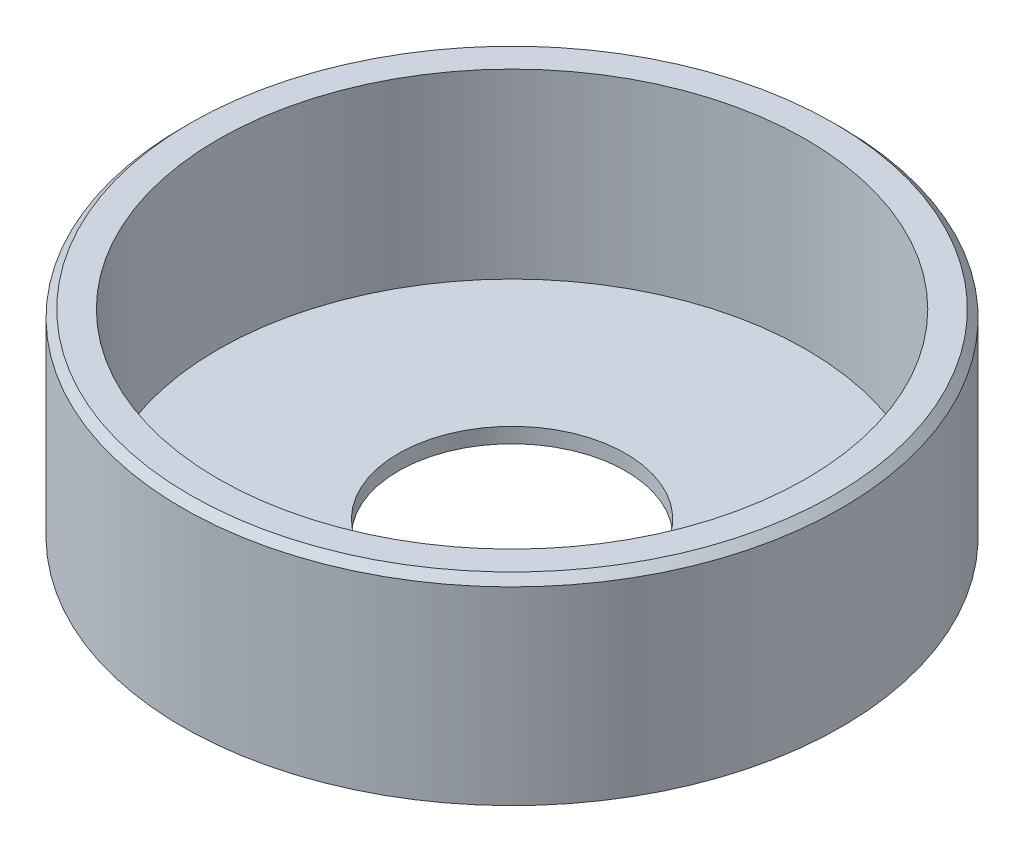
ISO-10303-21;
HEADER;
FILE_DESCRIPTION(('STEP AP214'),'2;1');
FILE_NAME('part.step','',(''),(''),'','','');
FILE_SCHEMA(('AUTOMOTIVE_DESIGN { 1 0 10303 214 1 1 1 1 }'));
ENDSEC;
DATA;
#1=APPLICATION_CONTEXT('core data for automotive mechanical design processes');
#2=APPLICATION_PROTOCOL_DEFINITION('international standard','automotive_design',2000,#1);
#3=PRODUCT_CONTEXT('',#1,'mechanical');
#4=PRODUCT('Part','Part','',(#3));
#5=PRODUCT_RELATED_PRODUCT_CATEGORY('part','',(#4));
#6=PRODUCT_DEFINITION_FORMATION('','',#4);
#7=PRODUCT_DEFINITION_CONTEXT('part definition',#1,'design');
#8=PRODUCT_DEFINITION('design','',#6,#7);
#9=PRODUCT_DEFINITION_SHAPE('','',#8);
#10=(LENGTH_UNIT() NAMED_UNIT(*) SI_UNIT(.MILLI.,.METRE.));
#11=(NAMED_UNIT(*) PLANE_ANGLE_UNIT() SI_UNIT($,.RADIAN.));
#12=(NAMED_UNIT(*) SI_UNIT($,.STERADIAN.) SOLID_ANGLE_UNIT());
#13=UNCERTAINTY_MEASURE_WITH_UNIT(LENGTH_MEASURE(1.E-05),#10,'distance_accuracy_value','');
#14=(GEOMETRIC_REPRESENTATION_CONTEXT(3) GLOBAL_UNCERTAINTY_ASSIGNED_CONTEXT((#13)) GLOBAL_UNIT_ASSIGNED_CONTEXT((#10,
#11,#12)) REPRESENTATION_CONTEXT('',''));
#15=CARTESIAN_POINT('',(0.,0.,0.));
#16=DIRECTION('',(0.,0.,1.));
#17=DIRECTION('',(1.,0.,0.));
#18=AXIS2_PLACEMENT_3D('',#15,#16,#17);
#19=CARTESIAN_POINT('',(0.,26.,0.));
#20=DIRECTION('',(0.,-1.,0.));
#21=DIRECTION('',(0.,0.,-1.));
#22=AXIS2_PLACEMENT_3D('',#19,#20,#21);
#23=CYLINDRICAL_SURFACE('',#22,43.5);
#24=CARTESIAN_POINT('',(0.,25.0000000000001,0.));
#25=DIRECTION('',(0.,1.,0.));
#26=DIRECTION('',(0.,0.,1.));
#27=AXIS2_PLACEMENT_3D('',#24,#25,#26);
#28=CIRCLE('',#27,43.5);
#29=CARTESIAN_POINT('',(0.,25.0000000000001,-43.5));
#30=VERTEX_POINT('',#29);
#31=EDGE_CURVE('E10',#30,#30,#28,.F.);
#32=CARTESIAN_POINT('',(0.,0.,0.));
#33=DIRECTION('',(0.,1.,0.));
#34=DIRECTION('',(0.,0.,1.));
#35=AXIS2_PLACEMENT_3D('',#32,#33,#34);
#36=CIRCLE('',#35,43.5);
#37=CARTESIAN_POINT('',(0.,0.,-43.5));
#38=VERTEX_POINT('',#37);
#39=EDGE_CURVE('E44',#38,#38,#36,.T.);
#40=CARTESIAN_POINT('',(0.,25.0000000000001,-43.5));
#41=CARTESIAN_POINT('',(0.,24.7395833333334,-43.5));
#42=CARTESIAN_POINT('',(0.,24.4791666666667,-43.5));
#43=CARTESIAN_POINT('',(0.,23.9583333333334,-43.5));
#44=CARTESIAN_POINT('',(0.,23.6979166666667,-43.5));
#45=CARTESIAN_POINT('',(0.,23.1770833333334,-43.5));
#46=CARTESIAN_POINT('',(0.,22.9166666666667,-43.5));
#47=CARTESIAN_POINT('',(0.,22.3958333333334,-43.5));
#48=CARTESIAN_POINT('',(0.,22.1354166666667,-43.5));
#49=CARTESIAN_POINT('',(0.,21.6145833333334,-43.5));
#50=CARTESIAN_POINT('',(0.,21.3541666666667,-43.5));
#51=CARTESIAN_POINT('',(0.,20.8333333333334,-43.5));
#52=CARTESIAN_POINT('',(0.,20.5729166666667,-43.5));
#53=CARTESIAN_POINT('',(0.,20.0520833333334,-43.5));
#54=CARTESIAN_POINT('',(0.,19.7916666666667,-43.5));
#55=CARTESIAN_POINT('',(0.,19.2708333333334,-43.5));
#56=CARTESIAN_POINT('',(0.,19.0104166666667,-43.5));
#57=CARTESIAN_POINT('',(0.,18.4895833333334,-43.5));
#58=CARTESIAN_POINT('',(0.,18.2291666666667,-43.5));
#59=CARTESIAN_POINT('',(0.,17.7083333333334,-43.5));
#60=CARTESIAN_POINT('',(0.,17.4479166666667,-43.5));
#61=CARTESIAN_POINT('',(0.,16.9270833333334,-43.5));
#62=CARTESIAN_POINT('',(0.,16.6666666666667,-43.5));
#63=CARTESIAN_POINT('',(0.,16.1458333333334,-43.5));
#64=CARTESIAN_POINT('',(0.,15.8854166666667,-43.5));
#65=CARTESIAN_POINT('',(0.,15.3645833333334,-43.5));
#66=CARTESIAN_POINT('',(0.,15.1041666666667,-43.5));
#67=CARTESIAN_POINT('',(0.,14.5833333333334,-43.5));
#68=CARTESIAN_POINT('',(0.,14.3229166666667,-43.5));
#69=CARTESIAN_POINT('',(0.,13.8020833333334,-43.5));
#70=CARTESIAN_POINT('',(0.,13.5416666666667,-43.5));
#71=CARTESIAN_POINT('',(0.,13.0208333333334,-43.5));
#72=CARTESIAN_POINT('',(0.,12.7604166666667,-43.5));
#73=CARTESIAN_POINT('',(0.,12.2395833333334,-43.5));
#74=CARTESIAN_POINT('',(0.,11.9791666666667,-43.5));
#75=CARTESIAN_POINT('',(0.,11.4583333333334,-43.5));
#76=CARTESIAN_POINT('',(0.,11.1979166666667,-43.5));
#77=CARTESIAN_POINT('',(0.,10.6770833333334,-43.5));
#78=CARTESIAN_POINT('',(0.,10.4166666666667,-43.5));
#79=CARTESIAN_POINT('',(0.,9.89583333333336,-43.5));
#80=CARTESIAN_POINT('',(0.,9.6354166666667,-43.5));
#81=CARTESIAN_POINT('',(0.,9.11458333333336,-43.5));
#82=CARTESIAN_POINT('',(0.,8.85416666666669,-43.5));
#83=CARTESIAN_POINT('',(0.,8.33333333333336,-43.5));
#84=CARTESIAN_POINT('',(0.,8.07291666666669,-43.5));
#85=CARTESIAN_POINT('',(0.,7.55208333333336,-43.5));
#86=CARTESIAN_POINT('',(0.,7.29166666666669,-43.5));
#87=CARTESIAN_POINT('',(0.,6.77083333333336,-43.5));
#88=CARTESIAN_POINT('',(0.,6.51041666666669,-43.5));
#89=CARTESIAN_POINT('',(0.,5.98958333333335,-43.5));
#90=CARTESIAN_POINT('',(0.,5.72916666666668,-43.5));
#91=CARTESIAN_POINT('',(0.,5.20833333333335,-43.5));
#92=CARTESIAN_POINT('',(0.,4.94791666666668,-43.5));
#93=CARTESIAN_POINT('',(0.,4.42708333333335,-43.5));
#94=CARTESIAN_POINT('',(0.,4.16666666666668,-43.5));
#95=CARTESIAN_POINT('',(0.,3.64583333333335,-43.5));
#96=CARTESIAN_POINT('',(0.,3.38541666666668,-43.5));
#97=CARTESIAN_POINT('',(0.,2.86458333333334,-43.5));
#98=CARTESIAN_POINT('',(0.,2.60416666666667,-43.5));
#99=CARTESIAN_POINT('',(0.,2.08333333333334,-43.5));
#100=CARTESIAN_POINT('',(0.,1.82291666666667,-43.5));
#101=CARTESIAN_POINT('',(0.,1.30208333333334,-43.5));
#102=CARTESIAN_POINT('',(0.,1.04166666666667,-43.5));
#103=CARTESIAN_POINT('',(0.,0.520833333333336,-43.5));
#104=CARTESIAN_POINT('',(0.,0.260416666666668,-43.5));
#105=CARTESIAN_POINT('',(0.,0.,-43.5));
#106=B_SPLINE_CURVE_WITH_KNOTS('',3,(#40,#41,#42,#43,#44,#45,#46,#47,#48,#49,#50,#51,#52,#53,
#54,#55,#56,#57,#58,#59,#60,#61,#62,#63,#64,#65,#66,#67,#68,#69,#70,#71,#72,#73,#74,#75,#76,#77,
#78,#79,#80,#81,#82,#83,#84,#85,#86,#87,#88,#89,#90,#91,#92,#93,#94,#95,#96,#97,#98,#99,#100,
#101,#102,#103,#104,#105),.UNSPECIFIED.,.F.,.F.,(4,2,2,2,2,2,2,2,2,2,2,2,2,2,2,2,2,2,2,2,2,2,2,
2,2,2,2,2,2,2,2,2,4),(0.,0.781250000000004,1.5625,2.34375000000001,3.12500000000001,
3.90625000000001,4.68750000000001,5.46875000000002,6.25000000000002,7.03125000000002,
7.81250000000002,8.59375000000003,9.37500000000003,10.15625,10.9375,11.71875,12.5,13.28125,
14.0625,14.84375,15.625,16.40625,17.1875000000001,17.96875,18.7500000000001,19.5312500000001,
20.3125000000001,21.0937500000001,21.8750000000001,22.6562500000001,23.4375000000001,
24.2187500000001,25.0000000000001),.UNSPECIFIED.);
#107=EDGE_CURVE('BSEAM33',#30,#38,#106,.T.);
#108=ORIENTED_EDGE('',*,*,#31,.T.);
#109=ORIENTED_EDGE('',*,*,#39,.T.);
#110=ORIENTED_EDGE('',*,*,#107,.T.);
#111=ORIENTED_EDGE('',*,*,#107,.F.);
#112=EDGE_LOOP('',(#108,#110,#109,#111));
#113=FACE_BOUND('',#112,.T.);
#114=ADVANCED_FACE('F33',(#113),#23,.T.);
#115=CARTESIAN_POINT('',(0.,26.,0.));
#116=DIRECTION('',(0.,1.,0.));
#117=DIRECTION('',(0.,0.,1.));
#118=AXIS2_PLACEMENT_3D('',#115,#116,#117);
#119=PLANE('',#118);
#120=CARTESIAN_POINT('',(0.,26.,0.));
#121=DIRECTION('',(0.,1.,0.));
#122=DIRECTION('',(0.,0.,1.));
#123=AXIS2_PLACEMENT_3D('',#120,#121,#122);
#124=CIRCLE('',#123,42.5000000000001);
#125=CARTESIAN_POINT('',(0.,26.,42.5000000000001));
#126=VERTEX_POINT('',#125);
#127=EDGE_CURVE('E40',#126,#126,#124,.T.);
#128=ORIENTED_EDGE('',*,*,#127,.T.);
#129=EDGE_LOOP('',(#128));
#130=FACE_BOUND('',#129,.T.);
#131=CARTESIAN_POINT('',(0.,26.,0.));
#132=DIRECTION('',(0.,1.,0.));
#133=DIRECTION('',(0.,0.,1.));
#134=AXIS2_PLACEMENT_3D('',#131,#132,#133);
#135=CIRCLE('',#134,38.8);
#136=CARTESIAN_POINT('',(0.,26.,38.8));
#137=VERTEX_POINT('',#136);
#138=EDGE_CURVE('E51',#137,#137,#135,.T.);
#139=ORIENTED_EDGE('',*,*,#138,.F.);
#140=EDGE_LOOP('',(#139));
#141=FACE_BOUND('',#140,.T.);
#142=ADVANCED_FACE('F84',(#130,#141),#119,.T.);
#143=CARTESIAN_POINT('',(0.,0.,0.));
#144=DIRECTION('',(0.,1.,0.));
#145=DIRECTION('',(0.,0.,1.));
#146=AXIS2_PLACEMENT_3D('',#143,#144,#145);
#147=PLANE('',#146);
#148=CARTESIAN_POINT('',(0.,0.,0.));
#149=DIRECTION('',(0.,1.,0.));
#150=DIRECTION('',(0.,0.,1.));
#151=AXIS2_PLACEMENT_3D('',#148,#149,#150);
#152=CIRCLE('',#151,15.);
#153=CARTESIAN_POINT('',(0.,0.,15.));
#154=VERTEX_POINT('',#153);
#155=EDGE_CURVE('E54',#154,#154,#152,.T.);
#156=ORIENTED_EDGE('',*,*,#155,.T.);
#157=EDGE_LOOP('',(#156));
#158=FACE_BOUND('',#157,.T.);
#159=ORIENTED_EDGE('',*,*,#39,.F.);
#160=EDGE_LOOP('',(#159));
#161=FACE_BOUND('',#160,.T.);
#162=ADVANCED_FACE('F63',(#158,#161),#147,.F.);
#163=CARTESIAN_POINT('',(0.,2.,0.));
#164=DIRECTION('',(0.,1.,0.));
#165=DIRECTION('',(0.,0.,1.));
#166=AXIS2_PLACEMENT_3D('',#163,#164,#165);
#167=CYLINDRICAL_SURFACE('',#166,38.8);
#168=CARTESIAN_POINT('',(0.,2.,0.));
#169=DIRECTION('',(0.,1.,0.));
#170=DIRECTION('',(0.,0.,1.));
#171=AXIS2_PLACEMENT_3D('',#168,#169,#170);
#172=CIRCLE('',#171,38.8);
#173=CARTESIAN_POINT('',(0.,2.,38.8));
#174=VERTEX_POINT('',#173);
#175=EDGE_CURVE('E48',#174,#174,#172,.T.);
#176=ORIENTED_EDGE('',*,*,#175,.F.);
#177=EDGE_LOOP('',(#176));
#178=FACE_BOUND('',#177,.T.);
#179=ORIENTED_EDGE('',*,*,#138,.T.);
#180=EDGE_LOOP('',(#179));
#181=FACE_BOUND('',#180,.T.);
#182=ADVANCED_FACE('F75',(#178,#181),#167,.F.);
#183=CARTESIAN_POINT('',(0.,2.,0.));
#184=DIRECTION('',(0.,1.,0.));
#185=DIRECTION('',(0.,0.,1.));
#186=AXIS2_PLACEMENT_3D('',#183,#184,#185);
#187=PLANE('',#186);
#188=CARTESIAN_POINT('',(0.,2.,0.));
#189=DIRECTION('',(0.,1.,0.));
#190=DIRECTION('',(0.,0.,1.));
#191=AXIS2_PLACEMENT_3D('',#188,#189,#190);
#192=CIRCLE('',#191,15.);
#193=CARTESIAN_POINT('',(0.,2.,15.));
#194=VERTEX_POINT('',#193);
#195=EDGE_CURVE('E57',#194,#194,#192,.T.);
#196=ORIENTED_EDGE('',*,*,#195,.F.);
#197=EDGE_LOOP('',(#196));
#198=FACE_BOUND('',#197,.T.);
#199=ORIENTED_EDGE('',*,*,#175,.T.);
#200=EDGE_LOOP('',(#199));
#201=FACE_BOUND('',#200,.T.);
#202=ADVANCED_FACE('F69',(#198,#201),#187,.T.);
#203=CARTESIAN_POINT('',(0.,0.,0.));
#204=DIRECTION('',(0.,1.,0.));
#205=DIRECTION('',(0.,0.,1.));
#206=AXIS2_PLACEMENT_3D('',#203,#204,#205);
#207=CYLINDRICAL_SURFACE('',#206,15.);
#208=ORIENTED_EDGE('',*,*,#155,.F.);
#209=EDGE_LOOP('',(#208));
#210=FACE_BOUND('',#209,.T.);
#211=ORIENTED_EDGE('',*,*,#195,.T.);
#212=EDGE_LOOP('',(#211));
#213=FACE_BOUND('',#212,.T.);
#214=ADVANCED_FACE('F66',(#210,#213),#207,.F.);
#215=CARTESIAN_POINT('',(0.,26.,0.));
#216=DIRECTION('',(0.,-1.,0.));
#217=DIRECTION('',(0.,0.,-1.));
#218=AXIS2_PLACEMENT_3D('',#215,#216,#217);
#219=CONICAL_SURFACE('',#218,42.5000000000001,0.785398163397431);
#220=ORIENTED_EDGE('',*,*,#31,.F.);
#221=EDGE_LOOP('',(#220));
#222=FACE_BOUND('',#221,.T.);
#223=ORIENTED_EDGE('',*,*,#127,.F.);
#224=EDGE_LOOP('',(#223));
#225=FACE_BOUND('',#224,.T.);
#226=ADVANCED_FACE('F35',(#222,#225),#219,.T.);
#227=CLOSED_SHELL('',(#114,#142,#162,#182,#202,#214,#226));
#228=MANIFOLD_SOLID_BREP('B2',#227);
#229=ADVANCED_BREP_SHAPE_REPRESENTATION('',(#18,#228),#14);
#230=SHAPE_DEFINITION_REPRESENTATION(#9,#229);
ENDSEC;
END-ISO-10303-21;
